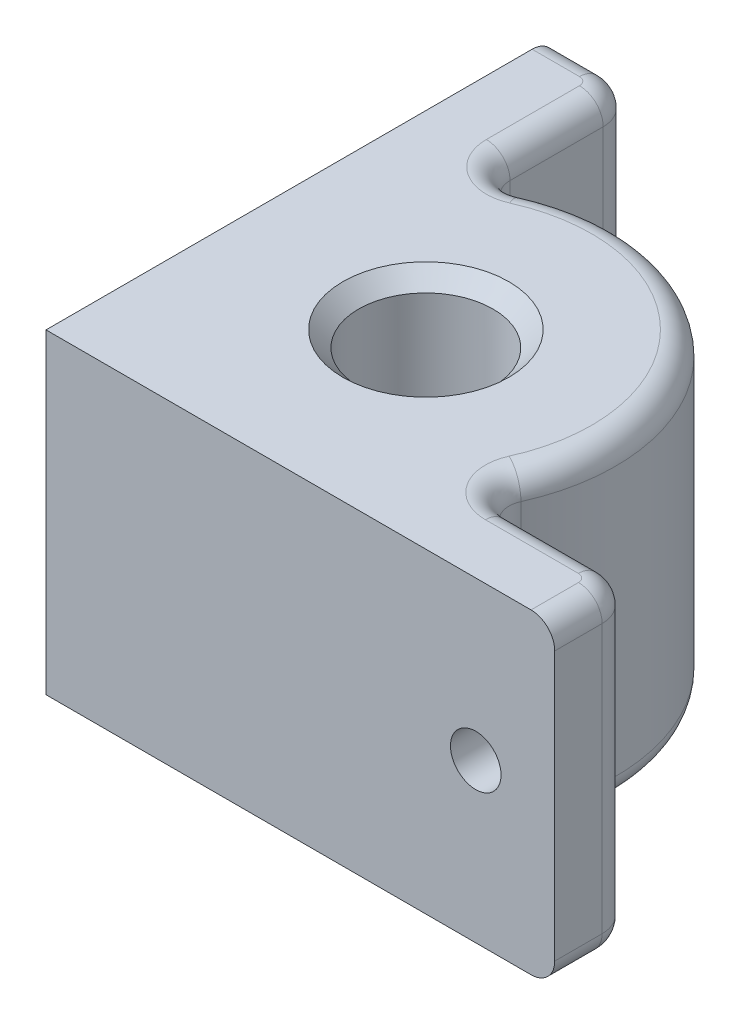
ISO-10303-21;
HEADER;
FILE_DESCRIPTION(('STEP AP214'),'2;1');
FILE_NAME('part.step','',(''),(''),'','','');
FILE_SCHEMA(('AUTOMOTIVE_DESIGN { 1 0 10303 214 1 1 1 1 }'));
ENDSEC;
DATA;
#1=APPLICATION_CONTEXT('core data for automotive mechanical design processes');
#2=APPLICATION_PROTOCOL_DEFINITION('international standard','automotive_design',2000,#1);
#3=PRODUCT_CONTEXT('',#1,'mechanical');
#4=PRODUCT('Part','Part','',(#3));
#5=PRODUCT_RELATED_PRODUCT_CATEGORY('part','',(#4));
#6=PRODUCT_DEFINITION_FORMATION('','',#4);
#7=PRODUCT_DEFINITION_CONTEXT('part definition',#1,'design');
#8=PRODUCT_DEFINITION('design','',#6,#7);
#9=PRODUCT_DEFINITION_SHAPE('','',#8);
#10=(LENGTH_UNIT() NAMED_UNIT(*) SI_UNIT(.MILLI.,.METRE.));
#11=(NAMED_UNIT(*) PLANE_ANGLE_UNIT() SI_UNIT($,.RADIAN.));
#12=(NAMED_UNIT(*) SI_UNIT($,.STERADIAN.) SOLID_ANGLE_UNIT());
#13=UNCERTAINTY_MEASURE_WITH_UNIT(LENGTH_MEASURE(1.E-05),#10,'distance_accuracy_value','');
#14=(GEOMETRIC_REPRESENTATION_CONTEXT(3) GLOBAL_UNCERTAINTY_ASSIGNED_CONTEXT((#13)) GLOBAL_UNIT_ASSIGNED_CONTEXT((#10,
#11,#12)) REPRESENTATION_CONTEXT('',''));
#15=CARTESIAN_POINT('',(0.,0.,0.));
#16=DIRECTION('',(0.,0.,1.));
#17=DIRECTION('',(1.,0.,0.));
#18=AXIS2_PLACEMENT_3D('',#15,#16,#17);
#19=CARTESIAN_POINT('',(65.4000000000055,170.67000014477,146.000000000005));
#20=DIRECTION('',(0.,1.,0.));
#21=DIRECTION('',(1.,0.,0.));
#22=AXIS2_PLACEMENT_3D('',#19,#20,#21);
#23=CYLINDRICAL_SURFACE('',#22,8.05000000000001);
#24=CARTESIAN_POINT('',(65.4000000000056,174.520000000011,146.000000000005));
#25=DIRECTION('',(0.,1.,0.));
#26=DIRECTION('',(1.,0.,0.));
#27=AXIS2_PLACEMENT_3D('',#24,#25,#26);
#28=CIRCLE('',#27,8.05000000000001);
#29=CARTESIAN_POINT('',(73.4500000000056,174.520000000011,146.000000000005));
#30=VERTEX_POINT('',#29);
#31=EDGE_CURVE('E11',#30,#30,#28,.T.);
#32=ORIENTED_EDGE('',*,*,#31,.T.);
#33=EDGE_LOOP('',(#32));
#34=FACE_BOUND('',#33,.T.);
#35=CARTESIAN_POINT('',(65.4000000000055,170.720000000011,146.000000000005));
#36=DIRECTION('',(0.,1.,0.));
#37=DIRECTION('',(-1.,0.,0.));
#38=AXIS2_PLACEMENT_3D('',#35,#36,#37);
#39=CIRCLE('',#38,8.05000000000001);
#40=CARTESIAN_POINT('',(57.3500000000055,170.720000000011,146.000000000005));
#41=VERTEX_POINT('',#40);
#42=EDGE_CURVE('E234',#41,#41,#39,.T.);
#43=ORIENTED_EDGE('',*,*,#42,.F.);
#44=EDGE_LOOP('',(#43));
#45=FACE_BOUND('',#44,.T.);
#46=ADVANCED_FACE('F38',(#34,#45),#23,.F.);
#47=CARTESIAN_POINT('',(60.9000153000318,180.020000000011,127.275000042648));
#48=DIRECTION('',(1.,0.,0.));
#49=DIRECTION('',(0.,0.,1.));
#50=AXIS2_PLACEMENT_3D('',#47,#48,#49);
#51=CYLINDRICAL_SURFACE('',#50,1.5);
#52=CARTESIAN_POINT('',(53.4000204000405,180.020000000011,127.275000042648));
#53=DIRECTION('',(1.,0.,0.));
#54=DIRECTION('',(0.,0.,1.));
#55=AXIS2_PLACEMENT_3D('',#52,#53,#54);
#56=CIRCLE('',#55,1.5);
#57=CARTESIAN_POINT('',(53.4000204000405,180.020000000011,125.775000042648));
#58=VERTEX_POINT('',#57);
#59=CARTESIAN_POINT('',(53.4000204000405,181.520000000011,127.275000042648));
#60=VERTEX_POINT('',#59);
#61=EDGE_CURVE('E48',#58,#60,#56,.T.);
#62=ORIENTED_EDGE('',*,*,#61,.T.);
#63=DIRECTION('',(1.,0.,0.));
#64=VECTOR('',#63,1.);
#65=CARTESIAN_POINT('',(60.9000153000319,181.520000000011,127.275000042648));
#66=LINE('',#65,#64);
#67=CARTESIAN_POINT('',(56.4000204000406,181.520000000011,127.275000042648));
#68=VERTEX_POINT('',#67);
#69=EDGE_CURVE('E57',#60,#68,#66,.T.);
#70=ORIENTED_EDGE('',*,*,#69,.T.);
#71=CARTESIAN_POINT('',(56.4000204000405,180.020000000011,127.275000042648));
#72=DIRECTION('',(-1.,0.,0.));
#73=DIRECTION('',(0.,0.,1.));
#74=AXIS2_PLACEMENT_3D('',#71,#72,#73);
#75=CIRCLE('',#74,1.49999999999999);
#76=CARTESIAN_POINT('',(56.4000204000405,180.020000000011,125.775000042648));
#77=VERTEX_POINT('',#76);
#78=EDGE_CURVE('E560',#68,#77,#75,.T.);
#79=ORIENTED_EDGE('',*,*,#78,.T.);
#80=DIRECTION('',(-1.,0.,0.));
#81=VECTOR('',#80,1.);
#82=CARTESIAN_POINT('',(60.9000153000318,180.020000000011,125.775000042648));
#83=LINE('',#82,#81);
#84=EDGE_CURVE('E557',#77,#58,#83,.T.);
#85=ORIENTED_EDGE('',*,*,#84,.T.);
#86=EDGE_LOOP('',(#62,#70,#79,#85));
#87=FACE_BOUND('',#86,.T.);
#88=ADVANCED_FACE('F258',(#87),#51,.T.);
#89=CARTESIAN_POINT('',(56.4000204000405,180.020000000011,127.775000042648));
#90=DIRECTION('',(0.,-1.,0.));
#91=DIRECTION('',(-1.,0.,0.));
#92=AXIS2_PLACEMENT_3D('',#89,#90,#91);
#93=DEGENERATE_TOROIDAL_SURFACE('',#92,0.5,1.5,.T.);
#94=CARTESIAN_POINT('',(56.9000204000405,180.020000000011,127.775000042648));
#95=DIRECTION('',(0.,0.,-1.));
#96=DIRECTION('',(0.,-1.,0.));
#97=AXIS2_PLACEMENT_3D('',#94,#95,#96);
#98=CIRCLE('',#97,1.49999999999999);
#99=CARTESIAN_POINT('',(56.9000204000406,181.520000000011,127.775000042648));
#100=VERTEX_POINT('',#99);
#101=CARTESIAN_POINT('',(58.4000204000405,180.020000000011,127.775000042648));
#102=VERTEX_POINT('',#101);
#103=EDGE_CURVE('E554',#100,#102,#98,.T.);
#104=ORIENTED_EDGE('',*,*,#103,.T.);
#105=CARTESIAN_POINT('',(56.4000204000405,180.020000000011,127.775000042648));
#106=DIRECTION('',(0.,1.,0.));
#107=DIRECTION('',(1.,0.,0.));
#108=AXIS2_PLACEMENT_3D('',#105,#106,#107);
#109=CIRCLE('',#108,2.);
#110=EDGE_CURVE('E552',#102,#77,#109,.T.);
#111=ORIENTED_EDGE('',*,*,#110,.T.);
#112=ORIENTED_EDGE('',*,*,#78,.F.);
#113=CARTESIAN_POINT('',(56.4000204000406,181.520000000011,127.775000042648));
#114=DIRECTION('',(0.,-1.,0.));
#115=DIRECTION('',(-1.,0.,0.));
#116=AXIS2_PLACEMENT_3D('',#113,#114,#115);
#117=CIRCLE('',#116,0.5);
#118=EDGE_CURVE('E550',#68,#100,#117,.T.);
#119=ORIENTED_EDGE('',*,*,#118,.T.);
#120=EDGE_LOOP('',(#104,#111,#112,#119));
#121=FACE_BOUND('',#120,.T.);
#122=ADVANCED_FACE('F264',(#121),#93,.T.);
#123=CARTESIAN_POINT('',(56.9000204000405,180.020000000011,136.697927492911));
#124=DIRECTION('',(0.,0.,1.));
#125=DIRECTION('',(1.,0.,0.));
#126=AXIS2_PLACEMENT_3D('',#123,#124,#125);
#127=CYLINDRICAL_SURFACE('',#126,1.5);
#128=CARTESIAN_POINT('',(56.9000204000405,180.020000000011,133.67116289345));
#129=DIRECTION('',(0.,0.,-1.));
#130=DIRECTION('',(0.,-1.,0.));
#131=AXIS2_PLACEMENT_3D('',#128,#129,#130);
#132=CIRCLE('',#131,1.49999999999999);
#133=CARTESIAN_POINT('',(56.9000204000405,181.520000000011,133.67116289345));
#134=VERTEX_POINT('',#133);
#135=CARTESIAN_POINT('',(58.4000204000405,180.020000000011,133.67116289345));
#136=VERTEX_POINT('',#135);
#137=EDGE_CURVE('E547',#134,#136,#132,.T.);
#138=ORIENTED_EDGE('',*,*,#137,.T.);
#139=DIRECTION('',(0.,0.,-1.));
#140=VECTOR('',#139,1.);
#141=CARTESIAN_POINT('',(58.4000204000405,180.020000000011,136.697927492911));
#142=LINE('',#141,#140);
#143=EDGE_CURVE('E543',#136,#102,#142,.T.);
#144=ORIENTED_EDGE('',*,*,#143,.T.);
#145=ORIENTED_EDGE('',*,*,#103,.F.);
#146=DIRECTION('',(0.,0.,1.));
#147=VECTOR('',#146,1.);
#148=CARTESIAN_POINT('',(56.9000204000405,181.520000000011,136.697927492911));
#149=LINE('',#148,#147);
#150=EDGE_CURVE('E541',#100,#134,#149,.T.);
#151=ORIENTED_EDGE('',*,*,#150,.T.);
#152=EDGE_LOOP('',(#138,#144,#145,#151));
#153=FACE_BOUND('',#152,.T.);
#154=ADVANCED_FACE('F329',(#153),#127,.T.);
#155=CARTESIAN_POINT('',(59.9000204000405,180.020000000011,133.67116289345));
#156=DIRECTION('',(0.,1.,0.));
#157=DIRECTION('',(1.,0.,0.));
#158=AXIS2_PLACEMENT_3D('',#155,#156,#157);
#159=TOROIDAL_SURFACE('',#158,3.,1.5);
#160=CARTESIAN_POINT('',(61.1222380889217,180.020000000011,136.410904472685));
#161=DIRECTION('',(-0.913247193078141,0.,0.407405896293728));
#162=DIRECTION('',(0.,1.,0.));
#163=AXIS2_PLACEMENT_3D('',#160,#161,#162);
#164=CIRCLE('',#163,1.49999999999999);
#165=CARTESIAN_POINT('',(61.1222380889218,181.520000000011,136.410904472685));
#166=VERTEX_POINT('',#165);
#167=CARTESIAN_POINT('',(60.5111292444811,180.020000000011,135.041033683068));
#168=VERTEX_POINT('',#167);
#169=EDGE_CURVE('E539',#166,#168,#164,.T.);
#170=ORIENTED_EDGE('',*,*,#169,.T.);
#171=CARTESIAN_POINT('',(59.9000204000405,180.020000000011,133.67116289345));
#172=DIRECTION('',(0.,-1.,0.));
#173=DIRECTION('',(-1.,0.,0.));
#174=AXIS2_PLACEMENT_3D('',#171,#172,#173);
#175=CIRCLE('',#174,1.5);
#176=EDGE_CURVE('E490',#168,#136,#175,.T.);
#177=ORIENTED_EDGE('',*,*,#176,.T.);
#178=ORIENTED_EDGE('',*,*,#137,.F.);
#179=CARTESIAN_POINT('',(59.9000204000406,181.520000000011,133.67116289345));
#180=DIRECTION('',(0.,1.,0.));
#181=DIRECTION('',(1.,0.,0.));
#182=AXIS2_PLACEMENT_3D('',#179,#180,#181);
#183=CIRCLE('',#182,3.);
#184=EDGE_CURVE('E488',#134,#166,#183,.T.);
#185=ORIENTED_EDGE('',*,*,#184,.T.);
#186=EDGE_LOOP('',(#170,#177,#178,#185));
#187=FACE_BOUND('',#186,.T.);
#188=ADVANCED_FACE('F332',(#187),#159,.T.);
#189=CARTESIAN_POINT('',(65.4000000000058,180.020000000011,146.000000000005));
#190=DIRECTION('',(0.,-1.,0.));
#191=DIRECTION('',(-1.,0.,0.));
#192=AXIS2_PLACEMENT_3D('',#189,#190,#191);
#193=TOROIDAL_SURFACE('',#192,10.5,1.5);
#194=CARTESIAN_POINT('',(74.9751488895736,180.02000000001,150.30888892206));
#195=DIRECTION('',(0.410370373529056,0.,-0.911918941863597));
#196=DIRECTION('',(0.,-1.,0.));
#197=AXIS2_PLACEMENT_3D('',#194,#195,#196);
#198=CIRCLE('',#197,1.49999999999999);
#199=CARTESIAN_POINT('',(74.9751488895736,181.52000000001,150.30888892206));
#200=VERTEX_POINT('',#199);
#201=CARTESIAN_POINT('',(76.343027302369,180.02000000001,150.924444482354));
#202=VERTEX_POINT('',#201);
#203=EDGE_CURVE('E484',#200,#202,#198,.T.);
#204=ORIENTED_EDGE('',*,*,#203,.T.);
#205=CARTESIAN_POINT('',(65.4000000000058,180.020000000011,146.000000000005));
#206=DIRECTION('',(0.,1.,0.));
#207=DIRECTION('',(1.,0.,0.));
#208=AXIS2_PLACEMENT_3D('',#205,#206,#207);
#209=CIRCLE('',#208,12.);
#210=EDGE_CURVE('E478',#202,#168,#209,.T.);
#211=ORIENTED_EDGE('',*,*,#210,.T.);
#212=ORIENTED_EDGE('',*,*,#169,.F.);
#213=CARTESIAN_POINT('',(65.4000000000059,181.520000000011,146.000000000005));
#214=DIRECTION('',(0.,-1.,0.));
#215=DIRECTION('',(-1.,0.,0.));
#216=AXIS2_PLACEMENT_3D('',#213,#214,#215);
#217=CIRCLE('',#216,10.5);
#218=EDGE_CURVE('E388',#166,#200,#217,.T.);
#219=ORIENTED_EDGE('',*,*,#218,.T.);
#220=EDGE_LOOP('',(#204,#211,#212,#219));
#221=FACE_BOUND('',#220,.T.);
#222=ADVANCED_FACE('F486',(#221),#193,.T.);
#223=CARTESIAN_POINT('',(77.7109057151644,180.02000000001,151.540000042648));
#224=DIRECTION('',(0.,1.,0.));
#225=DIRECTION('',(1.,0.,0.));
#226=AXIS2_PLACEMENT_3D('',#223,#224,#225);
#227=TOROIDAL_SURFACE('',#226,3.,1.5);
#228=CARTESIAN_POINT('',(77.7109057151644,180.02000000001,154.540000042648));
#229=DIRECTION('',(-1.,0.,0.));
#230=DIRECTION('',(0.,0.,1.));
#231=AXIS2_PLACEMENT_3D('',#228,#229,#230);
#232=CIRCLE('',#231,1.49999999999999);
#233=CARTESIAN_POINT('',(77.7109057151644,181.52000000001,154.540000042648));
#234=VERTEX_POINT('',#233);
#235=CARTESIAN_POINT('',(77.7109057151644,180.02000000001,153.040000042648));
#236=VERTEX_POINT('',#235);
#237=EDGE_CURVE('E382',#234,#236,#232,.T.);
#238=ORIENTED_EDGE('',*,*,#237,.T.);
#239=CARTESIAN_POINT('',(77.7109057151644,180.02000000001,151.540000042648));
#240=DIRECTION('',(0.,-1.,0.));
#241=DIRECTION('',(-1.,0.,0.));
#242=AXIS2_PLACEMENT_3D('',#239,#240,#241);
#243=CIRCLE('',#242,1.5);
#244=EDGE_CURVE('E372',#236,#202,#243,.T.);
#245=ORIENTED_EDGE('',*,*,#244,.T.);
#246=ORIENTED_EDGE('',*,*,#203,.F.);
#247=CARTESIAN_POINT('',(77.7109057151644,181.52000000001,151.540000042648));
#248=DIRECTION('',(0.,1.,0.));
#249=DIRECTION('',(1.,0.,0.));
#250=AXIS2_PLACEMENT_3D('',#247,#248,#249);
#251=CIRCLE('',#250,3.);
#252=EDGE_CURVE('E383',#200,#234,#251,.T.);
#253=ORIENTED_EDGE('',*,*,#252,.T.);
#254=EDGE_LOOP('',(#238,#245,#246,#253));
#255=FACE_BOUND('',#254,.T.);
#256=ADVANCED_FACE('F338',(#255),#227,.T.);
#257=CARTESIAN_POINT('',(71.3541716694838,180.020000000011,154.540000042648));
#258=DIRECTION('',(1.,0.,0.));
#259=DIRECTION('',(0.,0.,1.));
#260=AXIS2_PLACEMENT_3D('',#257,#258,#259);
#261=CYLINDRICAL_SURFACE('',#260,1.5);
#262=CARTESIAN_POINT('',(83.5980204000405,180.02000000001,154.540000042648));
#263=DIRECTION('',(-1.,0.,0.));
#264=DIRECTION('',(0.,0.,1.));
#265=AXIS2_PLACEMENT_3D('',#262,#263,#264);
#266=CIRCLE('',#265,1.49999999999999);
#267=CARTESIAN_POINT('',(83.5980204000406,181.52000000001,154.540000042648));
#268=VERTEX_POINT('',#267);
#269=CARTESIAN_POINT('',(83.5980204000405,180.02000000001,153.040000042648));
#270=VERTEX_POINT('',#269);
#271=EDGE_CURVE('E496',#268,#270,#266,.T.);
#272=ORIENTED_EDGE('',*,*,#271,.T.);
#273=DIRECTION('',(-1.,0.,0.));
#274=VECTOR('',#273,1.);
#275=CARTESIAN_POINT('',(71.3541716694838,180.020000000011,153.040000042648));
#276=LINE('',#275,#274);
#277=EDGE_CURVE('E393',#270,#236,#276,.T.);
#278=ORIENTED_EDGE('',*,*,#277,.T.);
#279=ORIENTED_EDGE('',*,*,#237,.F.);
#280=DIRECTION('',(1.,0.,0.));
#281=VECTOR('',#280,1.);
#282=CARTESIAN_POINT('',(71.3541716694838,181.520000000011,154.540000042648));
#283=LINE('',#282,#281);
#284=EDGE_CURVE('E499',#234,#268,#283,.T.);
#285=ORIENTED_EDGE('',*,*,#284,.T.);
#286=EDGE_LOOP('',(#272,#278,#279,#285));
#287=FACE_BOUND('',#286,.T.);
#288=ADVANCED_FACE('F334',(#287),#261,.T.);
#289=CARTESIAN_POINT('',(83.5980204000405,180.02000000001,155.040000042648));
#290=DIRECTION('',(0.,-1.,0.));
#291=DIRECTION('',(-1.,0.,0.));
#292=AXIS2_PLACEMENT_3D('',#289,#290,#291);
#293=DEGENERATE_TOROIDAL_SURFACE('',#292,0.5,1.5,.T.);
#294=CARTESIAN_POINT('',(84.0980204000405,180.02000000001,155.040000042648));
#295=DIRECTION('',(0.,0.,-1.));
#296=DIRECTION('',(0.,-1.,0.));
#297=AXIS2_PLACEMENT_3D('',#294,#295,#296);
#298=CIRCLE('',#297,1.49999999999995);
#299=CARTESIAN_POINT('',(84.0980204000406,181.52000000001,155.040000042648));
#300=VERTEX_POINT('',#299);
#301=CARTESIAN_POINT('',(85.5980204000405,180.02000000001,155.040000042648));
#302=VERTEX_POINT('',#301);
#303=EDGE_CURVE('E501',#300,#302,#298,.T.);
#304=ORIENTED_EDGE('',*,*,#303,.T.);
#305=CARTESIAN_POINT('',(83.5980204000405,180.02000000001,155.040000042648));
#306=DIRECTION('',(0.,1.,0.));
#307=DIRECTION('',(1.,0.,0.));
#308=AXIS2_PLACEMENT_3D('',#305,#306,#307);
#309=CIRCLE('',#308,2.);
#310=EDGE_CURVE('E504',#302,#270,#309,.T.);
#311=ORIENTED_EDGE('',*,*,#310,.T.);
#312=ORIENTED_EDGE('',*,*,#271,.F.);
#313=CARTESIAN_POINT('',(83.5980204000406,181.52000000001,155.040000042648));
#314=DIRECTION('',(0.,-1.,0.));
#315=DIRECTION('',(-1.,0.,0.));
#316=AXIS2_PLACEMENT_3D('',#313,#314,#315);
#317=CIRCLE('',#316,0.5);
#318=EDGE_CURVE('E506',#268,#300,#317,.T.);
#319=ORIENTED_EDGE('',*,*,#318,.T.);
#320=EDGE_LOOP('',(#304,#311,#312,#319));
#321=FACE_BOUND('',#320,.T.);
#322=ADVANCED_FACE('F337',(#321),#293,.T.);
#323=CARTESIAN_POINT('',(84.0980204000405,180.02000000001,148.540000042648));
#324=DIRECTION('',(0.,0.,1.));
#325=DIRECTION('',(1.,0.,0.));
#326=AXIS2_PLACEMENT_3D('',#323,#324,#325);
#327=CYLINDRICAL_SURFACE('',#326,1.5);
#328=DIRECTION('',(0.,0.,-1.));
#329=VECTOR('',#328,1.);
#330=CARTESIAN_POINT('',(85.5980204000405,180.02000000001,148.540000042648));
#331=LINE('',#330,#329);
#332=CARTESIAN_POINT('',(85.5980204000405,180.02000000001,158.040000042648));
#333=VERTEX_POINT('',#332);
#334=EDGE_CURVE('E511',#333,#302,#331,.T.);
#335=ORIENTED_EDGE('',*,*,#334,.T.);
#336=ORIENTED_EDGE('',*,*,#303,.F.);
#337=DIRECTION('',(0.,0.,1.));
#338=VECTOR('',#337,1.);
#339=CARTESIAN_POINT('',(84.0980204000405,181.52000000001,148.540000042648));
#340=LINE('',#339,#338);
#341=CARTESIAN_POINT('',(84.0980204000405,181.52000000001,158.040000042648));
#342=VERTEX_POINT('',#341);
#343=EDGE_CURVE('E513',#300,#342,#340,.T.);
#344=ORIENTED_EDGE('',*,*,#343,.T.);
#345=CARTESIAN_POINT('',(84.0980204000405,180.02000000001,158.040000042648));
#346=DIRECTION('',(0.,0.,-1.));
#347=DIRECTION('',(-1.,0.,0.));
#348=AXIS2_PLACEMENT_3D('',#345,#346,#347);
#349=CIRCLE('',#348,1.5);
#350=EDGE_CURVE('E508',#342,#333,#349,.T.);
#351=ORIENTED_EDGE('',*,*,#350,.T.);
#352=EDGE_LOOP('',(#335,#336,#344,#351));
#353=FACE_BOUND('',#352,.T.);
#354=ADVANCED_FACE('F340',(#353),#327,.T.);
#355=CARTESIAN_POINT('',(53.4000204000403,173.520000000011,125.775000042648));
#356=DIRECTION('',(0.,0.,-1.));
#357=DIRECTION('',(0.,1.,0.));
#358=AXIS2_PLACEMENT_3D('',#355,#356,#357);
#359=PLANE('',#358);
#360=ORIENTED_EDGE('',*,*,#84,.F.);
#361=DIRECTION('',(0.,1.,0.));
#362=VECTOR('',#361,1.);
#363=CARTESIAN_POINT('',(56.4000204000402,172.520000000011,125.775000042648));
#364=LINE('',#363,#362);
#365=CARTESIAN_POINT('',(56.4000204000399,163.020000000011,125.775000042647));
#366=VERTEX_POINT('',#365);
#367=EDGE_CURVE('E516',#366,#77,#364,.T.);
#368=ORIENTED_EDGE('',*,*,#367,.F.);
#369=DIRECTION('',(1.,0.,0.));
#370=VECTOR('',#369,1.);
#371=CARTESIAN_POINT('',(60.9000153000312,163.020000000011,125.775000042647));
#372=LINE('',#371,#370);
#373=CARTESIAN_POINT('',(53.4000204000399,163.020000000011,125.775000042647));
#374=VERTEX_POINT('',#373);
#375=EDGE_CURVE('E432',#374,#366,#372,.T.);
#376=ORIENTED_EDGE('',*,*,#375,.F.);
#377=DIRECTION('',(0.,-1.,0.));
#378=VECTOR('',#377,1.);
#379=CARTESIAN_POINT('',(53.4000204000403,173.520000000011,125.775000042647));
#380=LINE('',#379,#378);
#381=EDGE_CURVE('E231',#58,#374,#380,.T.);
#382=ORIENTED_EDGE('',*,*,#381,.F.);
#383=EDGE_LOOP('',(#360,#368,#376,#382));
#384=FACE_BOUND('',#383,.T.);
#385=ADVANCED_FACE('F343',(#384),#359,.T.);
#386=CARTESIAN_POINT('',(56.4000204000402,172.520000000011,127.775000042647));
#387=DIRECTION('',(0.,1.,0.));
#388=DIRECTION('',(1.,0.,0.));
#389=AXIS2_PLACEMENT_3D('',#386,#387,#388);
#390=CYLINDRICAL_SURFACE('',#389,2.);
#391=ORIENTED_EDGE('',*,*,#110,.F.);
#392=DIRECTION('',(0.,-1.,0.));
#393=VECTOR('',#392,1.);
#394=CARTESIAN_POINT('',(58.4000204000402,172.520000000011,127.775000042647));
#395=LINE('',#394,#393);
#396=CARTESIAN_POINT('',(58.4000204000399,163.020000000011,127.775000042647));
#397=VERTEX_POINT('',#396);
#398=EDGE_CURVE('E515',#102,#397,#395,.T.);
#399=ORIENTED_EDGE('',*,*,#398,.T.);
#400=CARTESIAN_POINT('',(56.4000204000399,163.020000000011,127.775000042647));
#401=DIRECTION('',(0.,-1.,0.));
#402=DIRECTION('',(-1.,0.,0.));
#403=AXIS2_PLACEMENT_3D('',#400,#401,#402);
#404=CIRCLE('',#403,2.);
#405=EDGE_CURVE('E445',#366,#397,#404,.T.);
#406=ORIENTED_EDGE('',*,*,#405,.F.);
#407=ORIENTED_EDGE('',*,*,#367,.T.);
#408=EDGE_LOOP('',(#391,#399,#406,#407));
#409=FACE_BOUND('',#408,.T.);
#410=ADVANCED_FACE('F345',(#409),#390,.T.);
#411=CARTESIAN_POINT('',(58.4000204000402,171.520000000011,130.355854943175));
#412=DIRECTION('',(1.,0.,0.));
#413=DIRECTION('',(0.,1.,0.));
#414=AXIS2_PLACEMENT_3D('',#411,#412,#413);
#415=PLANE('',#414);
#416=ORIENTED_EDGE('',*,*,#143,.F.);
#417=DIRECTION('',(0.,1.,0.));
#418=VECTOR('',#417,1.);
#419=CARTESIAN_POINT('',(58.4000204000403,173.520000000011,133.67116289345));
#420=LINE('',#419,#418);
#421=CARTESIAN_POINT('',(58.4000204000399,163.020000000011,133.67116289345));
#422=VERTEX_POINT('',#421);
#423=EDGE_CURVE('E396',#422,#136,#420,.T.);
#424=ORIENTED_EDGE('',*,*,#423,.F.);
#425=DIRECTION('',(0.,0.,1.));
#426=VECTOR('',#425,1.);
#427=CARTESIAN_POINT('',(58.4000204000399,163.020000000011,136.697927492911));
#428=LINE('',#427,#426);
#429=EDGE_CURVE('E452',#397,#422,#428,.T.);
#430=ORIENTED_EDGE('',*,*,#429,.F.);
#431=ORIENTED_EDGE('',*,*,#398,.F.);
#432=EDGE_LOOP('',(#416,#424,#430,#431));
#433=FACE_BOUND('',#432,.T.);
#434=CARTESIAN_POINT('',(58.4000204000402,171.520000000011,130.775014209364));
#435=DIRECTION('',(-1.,0.,0.));
#436=DIRECTION('',(0.,0.,1.));
#437=AXIS2_PLACEMENT_3D('',#434,#435,#436);
#438=CIRCLE('',#437,1.6);
#439=CARTESIAN_POINT('',(58.4000204000402,171.520000000011,132.375014209364));
#440=VERTEX_POINT('',#439);
#441=EDGE_CURVE('E519',#440,#440,#438,.T.);
#442=ORIENTED_EDGE('',*,*,#441,.T.);
#443=EDGE_LOOP('',(#442));
#444=FACE_BOUND('',#443,.T.);
#445=ADVANCED_FACE('F348',(#433,#444),#415,.T.);
#446=CARTESIAN_POINT('',(59.9000204000403,173.520000000011,133.67116289345));
#447=DIRECTION('',(0.,-1.,0.));
#448=DIRECTION('',(-1.,0.,0.));
#449=AXIS2_PLACEMENT_3D('',#446,#447,#448);
#450=CYLINDRICAL_SURFACE('',#449,1.5);
#451=ORIENTED_EDGE('',*,*,#176,.F.);
#452=DIRECTION('',(0.,-1.,0.));
#453=VECTOR('',#452,1.);
#454=CARTESIAN_POINT('',(60.5111292444809,173.520000000011,135.041033683067));
#455=LINE('',#454,#453);
#456=CARTESIAN_POINT('',(60.5111292444805,163.020000000011,135.041033683067));
#457=VERTEX_POINT('',#456);
#458=EDGE_CURVE('E399',#168,#457,#455,.T.);
#459=ORIENTED_EDGE('',*,*,#458,.T.);
#460=CARTESIAN_POINT('',(59.9000204000399,163.020000000011,133.67116289345));
#461=DIRECTION('',(0.,1.,0.));
#462=DIRECTION('',(1.,0.,0.));
#463=AXIS2_PLACEMENT_3D('',#460,#461,#462);
#464=CIRCLE('',#463,1.5);
#465=EDGE_CURVE('E459',#422,#457,#464,.T.);
#466=ORIENTED_EDGE('',*,*,#465,.F.);
#467=ORIENTED_EDGE('',*,*,#423,.T.);
#468=EDGE_LOOP('',(#451,#459,#466,#467));
#469=FACE_BOUND('',#468,.T.);
#470=ADVANCED_FACE('F352',(#469),#450,.F.);
#471=CARTESIAN_POINT('',(65.4000000000056,173.520000000011,146.000000000005));
#472=DIRECTION('',(0.,-1.,0.));
#473=DIRECTION('',(-1.,0.,0.));
#474=AXIS2_PLACEMENT_3D('',#471,#472,#473);
#475=CYLINDRICAL_SURFACE('',#474,12.);
#476=ORIENTED_EDGE('',*,*,#210,.F.);
#477=DIRECTION('',(0.,1.,0.));
#478=VECTOR('',#477,1.);
#479=CARTESIAN_POINT('',(76.3430273023687,173.52000000001,150.924444482354));
#480=LINE('',#479,#478);
#481=CARTESIAN_POINT('',(76.3430273023684,163.02000000001,150.924444482354));
#482=VERTEX_POINT('',#481);
#483=EDGE_CURVE('E378',#482,#202,#480,.T.);
#484=ORIENTED_EDGE('',*,*,#483,.F.);
#485=CARTESIAN_POINT('',(65.4000000000052,163.020000000011,146.000000000005));
#486=DIRECTION('',(0.,-1.,0.));
#487=DIRECTION('',(-1.,0.,0.));
#488=AXIS2_PLACEMENT_3D('',#485,#486,#487);
#489=CIRCLE('',#488,12.);
#490=EDGE_CURVE('E405',#457,#482,#489,.T.);
#491=ORIENTED_EDGE('',*,*,#490,.F.);
#492=ORIENTED_EDGE('',*,*,#458,.F.);
#493=EDGE_LOOP('',(#476,#484,#491,#492));
#494=FACE_BOUND('',#493,.T.);
#495=ADVANCED_FACE('F356',(#494),#475,.T.);
#496=CARTESIAN_POINT('',(77.7109057151641,173.52000000001,151.540000042648));
#497=DIRECTION('',(0.,-1.,0.));
#498=DIRECTION('',(-1.,0.,0.));
#499=AXIS2_PLACEMENT_3D('',#496,#497,#498);
#500=CYLINDRICAL_SURFACE('',#499,1.5);
#501=ORIENTED_EDGE('',*,*,#244,.F.);
#502=DIRECTION('',(0.,-1.,0.));
#503=VECTOR('',#502,1.);
#504=CARTESIAN_POINT('',(77.7109057151641,173.52000000001,153.040000042648));
#505=LINE('',#504,#503);
#506=CARTESIAN_POINT('',(77.7109057151638,163.02000000001,153.040000042647));
#507=VERTEX_POINT('',#506);
#508=EDGE_CURVE('E375',#236,#507,#505,.T.);
#509=ORIENTED_EDGE('',*,*,#508,.T.);
#510=CARTESIAN_POINT('',(77.7109057151638,163.02000000001,151.540000042647));
#511=DIRECTION('',(0.,1.,0.));
#512=DIRECTION('',(1.,0.,0.));
#513=AXIS2_PLACEMENT_3D('',#510,#511,#512);
#514=CIRCLE('',#513,1.5);
#515=EDGE_CURVE('E406',#482,#507,#514,.T.);
#516=ORIENTED_EDGE('',*,*,#515,.F.);
#517=ORIENTED_EDGE('',*,*,#483,.T.);
#518=EDGE_LOOP('',(#501,#509,#516,#517));
#519=FACE_BOUND('',#518,.T.);
#520=ADVANCED_FACE('F359',(#519),#500,.F.);
#521=CARTESIAN_POINT('',(74.3083331389442,173.520000000011,153.040000042648));
#522=DIRECTION('',(0.,0.,-1.));
#523=DIRECTION('',(0.,1.,0.));
#524=AXIS2_PLACEMENT_3D('',#521,#522,#523);
#525=PLANE('',#524);
#526=CARTESIAN_POINT('',(80.5981426744383,171.52000000001,153.040000042648));
#527=DIRECTION('',(0.,0.,-1.));
#528=DIRECTION('',(-1.,0.,0.));
#529=AXIS2_PLACEMENT_3D('',#526,#527,#528);
#530=CIRCLE('',#529,1.6);
#531=CARTESIAN_POINT('',(78.9981426744383,171.52000000001,153.040000042648));
#532=VERTEX_POINT('',#531);
#533=EDGE_CURVE('E227',#532,#532,#530,.T.);
#534=ORIENTED_EDGE('',*,*,#533,.F.);
#535=EDGE_LOOP('',(#534));
#536=FACE_BOUND('',#535,.T.);
#537=ORIENTED_EDGE('',*,*,#277,.F.);
#538=DIRECTION('',(0.,1.,0.));
#539=VECTOR('',#538,1.);
#540=CARTESIAN_POINT('',(83.5980204000403,173.52000000001,153.040000042648));
#541=LINE('',#540,#539);
#542=CARTESIAN_POINT('',(83.5980204000399,163.02000000001,153.040000042647));
#543=VERTEX_POINT('',#542);
#544=EDGE_CURVE('E412',#543,#270,#541,.T.);
#545=ORIENTED_EDGE('',*,*,#544,.F.);
#546=DIRECTION('',(1.,0.,0.));
#547=VECTOR('',#546,1.);
#548=CARTESIAN_POINT('',(71.3541716694832,163.020000000011,153.040000042647));
#549=LINE('',#548,#547);
#550=EDGE_CURVE('E204',#507,#543,#549,.T.);
#551=ORIENTED_EDGE('',*,*,#550,.F.);
#552=ORIENTED_EDGE('',*,*,#508,.F.);
#553=EDGE_LOOP('',(#537,#545,#551,#552));
#554=FACE_BOUND('',#553,.T.);
#555=ADVANCED_FACE('F362',(#536,#554),#525,.T.);
#556=CARTESIAN_POINT('',(83.5980204000403,173.52000000001,155.040000042648));
#557=DIRECTION('',(0.,-1.,0.));
#558=DIRECTION('',(-1.,0.,0.));
#559=AXIS2_PLACEMENT_3D('',#556,#557,#558);
#560=CYLINDRICAL_SURFACE('',#559,2.);
#561=ORIENTED_EDGE('',*,*,#310,.F.);
#562=DIRECTION('',(0.,-1.,0.));
#563=VECTOR('',#562,1.);
#564=CARTESIAN_POINT('',(85.5980204000403,173.52000000001,155.040000042648));
#565=LINE('',#564,#563);
#566=CARTESIAN_POINT('',(85.5980204000399,163.02000000001,155.040000042647));
#567=VERTEX_POINT('',#566);
#568=EDGE_CURVE('E401',#302,#567,#565,.T.);
#569=ORIENTED_EDGE('',*,*,#568,.T.);
#570=CARTESIAN_POINT('',(83.5980204000399,163.02000000001,155.040000042647));
#571=DIRECTION('',(0.,-1.,0.));
#572=DIRECTION('',(-1.,0.,0.));
#573=AXIS2_PLACEMENT_3D('',#570,#571,#572);
#574=CIRCLE('',#573,2.);
#575=EDGE_CURVE('E199',#543,#567,#574,.T.);
#576=ORIENTED_EDGE('',*,*,#575,.F.);
#577=ORIENTED_EDGE('',*,*,#544,.T.);
#578=EDGE_LOOP('',(#561,#569,#576,#577));
#579=FACE_BOUND('',#578,.T.);
#580=ADVANCED_FACE('F270',(#579),#560,.T.);
#581=CARTESIAN_POINT('',(85.5980204000403,173.52000000001,154.040000042648));
#582=DIRECTION('',(1.,0.,0.));
#583=DIRECTION('',(0.,1.,0.));
#584=AXIS2_PLACEMENT_3D('',#581,#582,#583);
#585=PLANE('',#584);
#586=DIRECTION('',(0.,-1.,0.));
#587=VECTOR('',#586,1.);
#588=CARTESIAN_POINT('',(85.5980204000403,173.52000000001,158.040000042648));
#589=LINE('',#588,#587);
#590=CARTESIAN_POINT('',(85.5980204000399,163.02000000001,158.040000042647));
#591=VERTEX_POINT('',#590);
#592=EDGE_CURVE('E414',#333,#591,#589,.T.);
#593=ORIENTED_EDGE('',*,*,#592,.T.);
#594=DIRECTION('',(0.,0.,1.));
#595=VECTOR('',#594,1.);
#596=CARTESIAN_POINT('',(85.5980204000399,163.02000000001,148.540000042647));
#597=LINE('',#596,#595);
#598=EDGE_CURVE('E191',#567,#591,#597,.T.);
#599=ORIENTED_EDGE('',*,*,#598,.F.);
#600=ORIENTED_EDGE('',*,*,#568,.F.);
#601=ORIENTED_EDGE('',*,*,#334,.F.);
#602=EDGE_LOOP('',(#593,#599,#600,#601));
#603=FACE_BOUND('',#602,.T.);
#604=ADVANCED_FACE('F585',(#603),#585,.T.);
#605=CARTESIAN_POINT('',(83.4000204000403,173.52000000001,158.040000042648));
#606=DIRECTION('',(0.,0.,1.));
#607=DIRECTION('',(0.,-1.,0.));
#608=AXIS2_PLACEMENT_3D('',#605,#606,#607);
#609=PLANE('',#608);
#610=ORIENTED_EDGE('',*,*,#350,.F.);
#611=DIRECTION('',(1.,0.,0.));
#612=VECTOR('',#611,1.);
#613=CARTESIAN_POINT('',(75.9000153000319,181.52000000001,158.040000042648));
#614=LINE('',#613,#612);
#615=CARTESIAN_POINT('',(53.4000204000405,181.520000000011,158.040000042648));
#616=VERTEX_POINT('',#615);
#617=EDGE_CURVE('E219',#616,#342,#614,.T.);
#618=ORIENTED_EDGE('',*,*,#617,.F.);
#619=DIRECTION('',(0.,-1.,0.));
#620=VECTOR('',#619,1.);
#621=CARTESIAN_POINT('',(53.4000204000403,173.520000000011,158.040000042648));
#622=LINE('',#621,#620);
#623=CARTESIAN_POINT('',(53.4000204000399,161.520000000011,158.040000042647));
#624=VERTEX_POINT('',#623);
#625=EDGE_CURVE('E420',#616,#624,#622,.T.);
#626=ORIENTED_EDGE('',*,*,#625,.T.);
#627=DIRECTION('',(-1.,0.,0.));
#628=VECTOR('',#627,1.);
#629=CARTESIAN_POINT('',(75.9000153000312,161.52000000001,158.040000042647));
#630=LINE('',#629,#628);
#631=CARTESIAN_POINT('',(84.0980204000399,161.52000000001,158.040000042647));
#632=VERTEX_POINT('',#631);
#633=EDGE_CURVE('E213',#632,#624,#630,.T.);
#634=ORIENTED_EDGE('',*,*,#633,.F.);
#635=CARTESIAN_POINT('',(84.0980204000399,163.02000000001,158.040000042647));
#636=DIRECTION('',(0.,0.,-1.));
#637=DIRECTION('',(-1.,0.,0.));
#638=AXIS2_PLACEMENT_3D('',#635,#636,#637);
#639=CIRCLE('',#638,1.5);
#640=EDGE_CURVE('E190',#591,#632,#639,.T.);
#641=ORIENTED_EDGE('',*,*,#640,.F.);
#642=ORIENTED_EDGE('',*,*,#592,.F.);
#643=EDGE_LOOP('',(#610,#618,#626,#634,#641,#642));
#644=FACE_BOUND('',#643,.T.);
#645=CARTESIAN_POINT('',(80.5981426744383,171.52000000001,158.040000042648));
#646=DIRECTION('',(0.,0.,1.));
#647=DIRECTION('',(1.,0.,0.));
#648=AXIS2_PLACEMENT_3D('',#645,#646,#647);
#649=CIRCLE('',#648,1.6);
#650=CARTESIAN_POINT('',(82.1981426744384,171.52000000001,158.040000042648));
#651=VERTEX_POINT('',#650);
#652=EDGE_CURVE('E223',#651,#651,#649,.T.);
#653=ORIENTED_EDGE('',*,*,#652,.F.);
#654=EDGE_LOOP('',(#653));
#655=FACE_BOUND('',#654,.T.);
#656=ADVANCED_FACE('F276',(#644,#655),#609,.T.);
#657=CARTESIAN_POINT('',(60.9000153000312,163.020000000011,127.275000042647));
#658=DIRECTION('',(1.,0.,0.));
#659=DIRECTION('',(0.,0.,1.));
#660=AXIS2_PLACEMENT_3D('',#657,#658,#659);
#661=CYLINDRICAL_SURFACE('',#660,1.5);
#662=CARTESIAN_POINT('',(53.4000204000399,163.020000000011,127.275000042647));
#663=DIRECTION('',(1.,0.,0.));
#664=DIRECTION('',(0.,0.,1.));
#665=AXIS2_PLACEMENT_3D('',#662,#663,#664);
#666=CIRCLE('',#665,1.5);
#667=CARTESIAN_POINT('',(53.4000204000399,161.520000000011,127.275000042647));
#668=VERTEX_POINT('',#667);
#669=EDGE_CURVE('E425',#668,#374,#666,.T.);
#670=ORIENTED_EDGE('',*,*,#669,.T.);
#671=ORIENTED_EDGE('',*,*,#375,.T.);
#672=CARTESIAN_POINT('',(56.4000204000399,163.020000000011,127.275000042647));
#673=DIRECTION('',(-1.,0.,0.));
#674=DIRECTION('',(0.,0.,1.));
#675=AXIS2_PLACEMENT_3D('',#672,#673,#674);
#676=CIRCLE('',#675,1.5);
#677=CARTESIAN_POINT('',(56.4000204000399,161.520000000011,127.275000042647));
#678=VERTEX_POINT('',#677);
#679=EDGE_CURVE('E433',#366,#678,#676,.T.);
#680=ORIENTED_EDGE('',*,*,#679,.T.);
#681=DIRECTION('',(-1.,0.,0.));
#682=VECTOR('',#681,1.);
#683=CARTESIAN_POINT('',(60.9000153000312,161.520000000011,127.275000042647));
#684=LINE('',#683,#682);
#685=EDGE_CURVE('E436',#678,#668,#684,.T.);
#686=ORIENTED_EDGE('',*,*,#685,.T.);
#687=EDGE_LOOP('',(#670,#671,#680,#686));
#688=FACE_BOUND('',#687,.T.);
#689=ADVANCED_FACE('F272',(#688),#661,.T.);
#690=CARTESIAN_POINT('',(56.4000204000399,163.020000000011,127.775000042647));
#691=DIRECTION('',(0.,1.,0.));
#692=DIRECTION('',(1.,0.,0.));
#693=AXIS2_PLACEMENT_3D('',#690,#691,#692);
#694=DEGENERATE_TOROIDAL_SURFACE('',#693,0.5,1.5,.T.);
#695=CARTESIAN_POINT('',(56.9000204000399,163.020000000011,127.775000042647));
#696=DIRECTION('',(0.,0.,-1.));
#697=DIRECTION('',(0.,-1.,0.));
#698=AXIS2_PLACEMENT_3D('',#695,#696,#697);
#699=CIRCLE('',#698,1.5);
#700=CARTESIAN_POINT('',(56.9000204000399,161.520000000011,127.775000042647));
#701=VERTEX_POINT('',#700);
#702=EDGE_CURVE('E439',#397,#701,#699,.T.);
#703=ORIENTED_EDGE('',*,*,#702,.T.);
#704=CARTESIAN_POINT('',(56.4000204000399,161.520000000011,127.775000042647));
#705=DIRECTION('',(0.,1.,0.));
#706=DIRECTION('',(1.,0.,0.));
#707=AXIS2_PLACEMENT_3D('',#704,#705,#706);
#708=CIRCLE('',#707,0.5);
#709=EDGE_CURVE('E442',#701,#678,#708,.T.);
#710=ORIENTED_EDGE('',*,*,#709,.T.);
#711=ORIENTED_EDGE('',*,*,#679,.F.);
#712=ORIENTED_EDGE('',*,*,#405,.T.);
#713=EDGE_LOOP('',(#703,#710,#711,#712));
#714=FACE_BOUND('',#713,.T.);
#715=ADVANCED_FACE('F275',(#714),#694,.T.);
#716=CARTESIAN_POINT('',(56.9000204000399,163.020000000011,136.697927492911));
#717=DIRECTION('',(0.,0.,1.));
#718=DIRECTION('',(1.,0.,0.));
#719=AXIS2_PLACEMENT_3D('',#716,#717,#718);
#720=CYLINDRICAL_SURFACE('',#719,1.5);
#721=CARTESIAN_POINT('',(56.9000204000399,163.020000000011,133.67116289345));
#722=DIRECTION('',(0.,0.,-1.));
#723=DIRECTION('',(0.,-1.,0.));
#724=AXIS2_PLACEMENT_3D('',#721,#722,#723);
#725=CIRCLE('',#724,1.50000000000001);
#726=CARTESIAN_POINT('',(56.9000204000399,161.520000000011,133.67116289345));
#727=VERTEX_POINT('',#726);
#728=EDGE_CURVE('E446',#422,#727,#725,.T.);
#729=ORIENTED_EDGE('',*,*,#728,.T.);
#730=DIRECTION('',(0.,0.,-1.));
#731=VECTOR('',#730,1.);
#732=CARTESIAN_POINT('',(56.9000204000399,161.520000000011,136.697927492911));
#733=LINE('',#732,#731);
#734=EDGE_CURVE('E449',#727,#701,#733,.T.);
#735=ORIENTED_EDGE('',*,*,#734,.T.);
#736=ORIENTED_EDGE('',*,*,#702,.F.);
#737=ORIENTED_EDGE('',*,*,#429,.T.);
#738=EDGE_LOOP('',(#729,#735,#736,#737));
#739=FACE_BOUND('',#738,.T.);
#740=ADVANCED_FACE('F278',(#739),#720,.T.);
#741=CARTESIAN_POINT('',(59.9000204000399,163.020000000011,133.67116289345));
#742=DIRECTION('',(0.,-1.,0.));
#743=DIRECTION('',(-1.,0.,0.));
#744=AXIS2_PLACEMENT_3D('',#741,#742,#743);
#745=TOROIDAL_SURFACE('',#744,3.,1.5);
#746=CARTESIAN_POINT('',(61.1222380889211,163.020000000011,136.410904472685));
#747=DIRECTION('',(-0.913247193078139,0.,0.407405896293733));
#748=DIRECTION('',(0.,1.,0.));
#749=AXIS2_PLACEMENT_3D('',#746,#747,#748);
#750=CIRCLE('',#749,1.50000000000003);
#751=CARTESIAN_POINT('',(61.1222380889211,161.520000000011,136.410904472685));
#752=VERTEX_POINT('',#751);
#753=EDGE_CURVE('E453',#457,#752,#750,.T.);
#754=ORIENTED_EDGE('',*,*,#753,.T.);
#755=CARTESIAN_POINT('',(59.9000204000399,161.520000000011,133.67116289345));
#756=DIRECTION('',(0.,-1.,0.));
#757=DIRECTION('',(-1.,0.,0.));
#758=AXIS2_PLACEMENT_3D('',#755,#756,#757);
#759=CIRCLE('',#758,3.);
#760=EDGE_CURVE('E456',#752,#727,#759,.T.);
#761=ORIENTED_EDGE('',*,*,#760,.T.);
#762=ORIENTED_EDGE('',*,*,#728,.F.);
#763=ORIENTED_EDGE('',*,*,#465,.T.);
#764=EDGE_LOOP('',(#754,#761,#762,#763));
#765=FACE_BOUND('',#764,.T.);
#766=ADVANCED_FACE('F281',(#765),#745,.T.);
#767=CARTESIAN_POINT('',(65.4000000000052,163.020000000011,146.000000000005));
#768=DIRECTION('',(0.,-1.,0.));
#769=DIRECTION('',(-1.,0.,0.));
#770=AXIS2_PLACEMENT_3D('',#767,#768,#769);
#771=TOROIDAL_SURFACE('',#770,10.5,1.5);
#772=CARTESIAN_POINT('',(74.975148889573,163.020000000011,150.30888892206));
#773=DIRECTION('',(0.410370373529056,0.,-0.911918941863597));
#774=DIRECTION('',(0.,-1.,0.));
#775=AXIS2_PLACEMENT_3D('',#772,#773,#774);
#776=CIRCLE('',#775,1.49999999999999);
#777=CARTESIAN_POINT('',(74.9751488895729,161.52000000001,150.30888892206));
#778=VERTEX_POINT('',#777);
#779=EDGE_CURVE('E460',#482,#778,#776,.T.);
#780=ORIENTED_EDGE('',*,*,#779,.T.);
#781=CARTESIAN_POINT('',(65.4000000000052,161.520000000011,146.000000000005));
#782=DIRECTION('',(0.,1.,0.));
#783=DIRECTION('',(1.,0.,0.));
#784=AXIS2_PLACEMENT_3D('',#781,#782,#783);
#785=CIRCLE('',#784,10.5);
#786=EDGE_CURVE('E463',#778,#752,#785,.T.);
#787=ORIENTED_EDGE('',*,*,#786,.T.);
#788=ORIENTED_EDGE('',*,*,#753,.F.);
#789=ORIENTED_EDGE('',*,*,#490,.T.);
#790=EDGE_LOOP('',(#780,#787,#788,#789));
#791=FACE_BOUND('',#790,.T.);
#792=ADVANCED_FACE('F475',(#791),#771,.T.);
#793=CARTESIAN_POINT('',(77.7109057151638,163.02000000001,151.540000042647));
#794=DIRECTION('',(0.,-1.,0.));
#795=DIRECTION('',(-1.,0.,0.));
#796=AXIS2_PLACEMENT_3D('',#793,#794,#795);
#797=TOROIDAL_SURFACE('',#796,3.,1.5);
#798=CARTESIAN_POINT('',(77.7109057151638,163.02000000001,154.540000042648));
#799=DIRECTION('',(-1.,0.,0.));
#800=DIRECTION('',(0.,0.,1.));
#801=AXIS2_PLACEMENT_3D('',#798,#799,#800);
#802=CIRCLE('',#801,1.50000000000002);
#803=CARTESIAN_POINT('',(77.7109057151637,161.52000000001,154.540000042648));
#804=VERTEX_POINT('',#803);
#805=EDGE_CURVE('E466',#507,#804,#802,.T.);
#806=ORIENTED_EDGE('',*,*,#805,.T.);
#807=CARTESIAN_POINT('',(77.7109057151637,161.52000000001,151.540000042647));
#808=DIRECTION('',(0.,-1.,0.));
#809=DIRECTION('',(-1.,0.,0.));
#810=AXIS2_PLACEMENT_3D('',#807,#808,#809);
#811=CIRCLE('',#810,3.);
#812=EDGE_CURVE('E408',#804,#778,#811,.T.);
#813=ORIENTED_EDGE('',*,*,#812,.T.);
#814=ORIENTED_EDGE('',*,*,#779,.F.);
#815=ORIENTED_EDGE('',*,*,#515,.T.);
#816=EDGE_LOOP('',(#806,#813,#814,#815));
#817=FACE_BOUND('',#816,.T.);
#818=ADVANCED_FACE('F286',(#817),#797,.T.);
#819=CARTESIAN_POINT('',(71.3541716694832,163.020000000011,154.540000042647));
#820=DIRECTION('',(-1.,0.,0.));
#821=DIRECTION('',(0.,0.,1.));
#822=AXIS2_PLACEMENT_3D('',#819,#820,#821);
#823=CYLINDRICAL_SURFACE('',#822,1.5);
#824=CARTESIAN_POINT('',(83.5980204000399,163.02000000001,154.540000042647));
#825=DIRECTION('',(-1.,0.,0.));
#826=DIRECTION('',(0.,0.,1.));
#827=AXIS2_PLACEMENT_3D('',#824,#825,#826);
#828=CIRCLE('',#827,1.49999999999999);
#829=CARTESIAN_POINT('',(83.5980204000399,161.52000000001,154.540000042647));
#830=VERTEX_POINT('',#829);
#831=EDGE_CURVE('E409',#543,#830,#828,.T.);
#832=ORIENTED_EDGE('',*,*,#831,.T.);
#833=DIRECTION('',(-1.,0.,0.));
#834=VECTOR('',#833,1.);
#835=CARTESIAN_POINT('',(71.3541716694832,161.520000000011,154.540000042647));
#836=LINE('',#835,#834);
#837=EDGE_CURVE('E178',#830,#804,#836,.T.);
#838=ORIENTED_EDGE('',*,*,#837,.T.);
#839=ORIENTED_EDGE('',*,*,#805,.F.);
#840=ORIENTED_EDGE('',*,*,#550,.T.);
#841=EDGE_LOOP('',(#832,#838,#839,#840));
#842=FACE_BOUND('',#841,.T.);
#843=ADVANCED_FACE('F283',(#842),#823,.T.);
#844=CARTESIAN_POINT('',(83.5980204000399,163.02000000001,155.040000042647));
#845=DIRECTION('',(0.,1.,0.));
#846=DIRECTION('',(1.,0.,0.));
#847=AXIS2_PLACEMENT_3D('',#844,#845,#846);
#848=DEGENERATE_TOROIDAL_SURFACE('',#847,0.5,1.5,.T.);
#849=CARTESIAN_POINT('',(84.0980204000399,163.02000000001,155.040000042647));
#850=DIRECTION('',(0.,0.,-1.));
#851=DIRECTION('',(0.,-1.,0.));
#852=AXIS2_PLACEMENT_3D('',#849,#850,#851);
#853=CIRCLE('',#852,1.49999999999999);
#854=CARTESIAN_POINT('',(84.0980204000399,161.52000000001,155.040000042647));
#855=VERTEX_POINT('',#854);
#856=EDGE_CURVE('E188',#567,#855,#853,.T.);
#857=ORIENTED_EDGE('',*,*,#856,.T.);
#858=CARTESIAN_POINT('',(83.5980204000399,161.52000000001,155.040000042647));
#859=DIRECTION('',(0.,1.,0.));
#860=DIRECTION('',(1.,0.,0.));
#861=AXIS2_PLACEMENT_3D('',#858,#859,#860);
#862=CIRCLE('',#861,0.5);
#863=EDGE_CURVE('E194',#855,#830,#862,.T.);
#864=ORIENTED_EDGE('',*,*,#863,.T.);
#865=ORIENTED_EDGE('',*,*,#831,.F.);
#866=ORIENTED_EDGE('',*,*,#575,.T.);
#867=EDGE_LOOP('',(#857,#864,#865,#866));
#868=FACE_BOUND('',#867,.T.);
#869=ADVANCED_FACE('F202',(#868),#848,.T.);
#870=CARTESIAN_POINT('',(84.0980204000399,163.02000000001,148.540000042647));
#871=DIRECTION('',(0.,0.,-1.));
#872=DIRECTION('',(-1.,0.,0.));
#873=AXIS2_PLACEMENT_3D('',#870,#871,#872);
#874=CYLINDRICAL_SURFACE('',#873,1.5);
#875=DIRECTION('',(0.,0.,-1.));
#876=VECTOR('',#875,1.);
#877=CARTESIAN_POINT('',(84.0980204000399,161.52000000001,148.540000042647));
#878=LINE('',#877,#876);
#879=EDGE_CURVE('E185',#632,#855,#878,.T.);
#880=ORIENTED_EDGE('',*,*,#879,.T.);
#881=ORIENTED_EDGE('',*,*,#856,.F.);
#882=ORIENTED_EDGE('',*,*,#598,.T.);
#883=ORIENTED_EDGE('',*,*,#640,.T.);
#884=EDGE_LOOP('',(#880,#881,#882,#883));
#885=FACE_BOUND('',#884,.T.);
#886=ADVANCED_FACE('F186',(#885),#874,.T.);
#887=CARTESIAN_POINT('',(68.4000102000225,161.520000000011,143.040000042647));
#888=DIRECTION('',(0.,1.,0.));
#889=DIRECTION('',(-1.,0.,0.));
#890=AXIS2_PLACEMENT_3D('',#887,#888,#889);
#891=PLANE('',#890);
#892=DIRECTION('',(0.,0.,-1.));
#893=VECTOR('',#892,1.);
#894=CARTESIAN_POINT('',(53.4000204000399,161.520000000011,150.540000042647));
#895=LINE('',#894,#893);
#896=EDGE_CURVE('E211',#624,#668,#895,.T.);
#897=ORIENTED_EDGE('',*,*,#896,.T.);
#898=ORIENTED_EDGE('',*,*,#685,.F.);
#899=ORIENTED_EDGE('',*,*,#709,.F.);
#900=ORIENTED_EDGE('',*,*,#734,.F.);
#901=ORIENTED_EDGE('',*,*,#760,.F.);
#902=ORIENTED_EDGE('',*,*,#786,.F.);
#903=ORIENTED_EDGE('',*,*,#812,.F.);
#904=ORIENTED_EDGE('',*,*,#837,.F.);
#905=ORIENTED_EDGE('',*,*,#863,.F.);
#906=ORIENTED_EDGE('',*,*,#879,.F.);
#907=ORIENTED_EDGE('',*,*,#633,.T.);
#908=EDGE_LOOP('',(#897,#898,#899,#900,#901,#902,#903,#904,#905,#906,#907));
#909=FACE_BOUND('',#908,.T.);
#910=CARTESIAN_POINT('',(65.4000000000052,161.520000000011,146.000000000005));
#911=DIRECTION('',(0.,-1.,0.));
#912=DIRECTION('',(-1.,0.,0.));
#913=AXIS2_PLACEMENT_3D('',#910,#911,#912);
#914=CIRCLE('',#913,9.34999999999999);
#915=CARTESIAN_POINT('',(56.0500000000052,161.520000000011,146.000000000005));
#916=VERTEX_POINT('',#915);
#917=EDGE_CURVE('E215',#916,#916,#914,.T.);
#918=ORIENTED_EDGE('',*,*,#917,.F.);
#919=EDGE_LOOP('',(#918));
#920=FACE_BOUND('',#919,.T.);
#921=ADVANCED_FACE('F195',(#909,#920),#891,.F.);
#922=CARTESIAN_POINT('',(68.4000102000232,181.520000000011,143.040000042648));
#923=DIRECTION('',(0.,1.,0.));
#924=DIRECTION('',(-1.,0.,0.));
#925=AXIS2_PLACEMENT_3D('',#922,#923,#924);
#926=PLANE('',#925);
#927=ORIENTED_EDGE('',*,*,#617,.T.);
#928=ORIENTED_EDGE('',*,*,#343,.F.);
#929=ORIENTED_EDGE('',*,*,#318,.F.);
#930=ORIENTED_EDGE('',*,*,#284,.F.);
#931=ORIENTED_EDGE('',*,*,#252,.F.);
#932=ORIENTED_EDGE('',*,*,#218,.F.);
#933=ORIENTED_EDGE('',*,*,#184,.F.);
#934=ORIENTED_EDGE('',*,*,#150,.F.);
#935=ORIENTED_EDGE('',*,*,#118,.F.);
#936=ORIENTED_EDGE('',*,*,#69,.F.);
#937=DIRECTION('',(0.,0.,1.));
#938=VECTOR('',#937,1.);
#939=CARTESIAN_POINT('',(53.4000204000405,181.520000000011,150.540000042648));
#940=LINE('',#939,#938);
#941=EDGE_CURVE('E214',#60,#616,#940,.T.);
#942=ORIENTED_EDGE('',*,*,#941,.T.);
#943=EDGE_LOOP('',(#927,#928,#929,#930,#931,#932,#933,#934,#935,#936,#942));
#944=FACE_BOUND('',#943,.T.);
#945=CARTESIAN_POINT('',(65.4000000000059,181.520000000011,146.000000000005));
#946=DIRECTION('',(0.,-1.,0.));
#947=DIRECTION('',(-1.,0.,0.));
#948=AXIS2_PLACEMENT_3D('',#945,#946,#947);
#949=CIRCLE('',#948,5.2499999999985);
#950=CARTESIAN_POINT('',(60.1500000000074,181.520000000011,146.000000000005));
#951=VERTEX_POINT('',#950);
#952=EDGE_CURVE('E220',#951,#951,#949,.T.);
#953=ORIENTED_EDGE('',*,*,#952,.T.);
#954=EDGE_LOOP('',(#953));
#955=FACE_BOUND('',#954,.T.);
#956=ADVANCED_FACE('F309',(#944,#955),#926,.T.);
#957=CARTESIAN_POINT('',(80.5981426744383,171.52000000001,155.040000042648));
#958=DIRECTION('',(0.,0.,-1.));
#959=DIRECTION('',(0.,-1.,0.));
#960=AXIS2_PLACEMENT_3D('',#957,#958,#959);
#961=CYLINDRICAL_SURFACE('',#960,1.6);
#962=ORIENTED_EDGE('',*,*,#652,.T.);
#963=EDGE_LOOP('',(#962));
#964=FACE_BOUND('',#963,.T.);
#965=ORIENTED_EDGE('',*,*,#533,.T.);
#966=EDGE_LOOP('',(#965));
#967=FACE_BOUND('',#966,.T.);
#968=ADVANCED_FACE('F311',(#964,#967),#961,.F.);
#969=CARTESIAN_POINT('',(56.4000204000402,171.520000000011,130.775014209364));
#970=DIRECTION('',(1.,0.,0.));
#971=DIRECTION('',(0.,0.,1.));
#972=AXIS2_PLACEMENT_3D('',#969,#970,#971);
#973=CYLINDRICAL_SURFACE('',#972,1.6);
#974=CARTESIAN_POINT('',(53.4000204000402,171.520000000011,130.775014209364));
#975=DIRECTION('',(-1.,0.,0.));
#976=DIRECTION('',(0.,0.,1.));
#977=AXIS2_PLACEMENT_3D('',#974,#975,#976);
#978=CIRCLE('',#977,1.6);
#979=CARTESIAN_POINT('',(53.4000204000402,171.520000000011,132.375014209364));
#980=VERTEX_POINT('',#979);
#981=EDGE_CURVE('E224',#980,#980,#978,.T.);
#982=ORIENTED_EDGE('',*,*,#981,.T.);
#983=EDGE_LOOP('',(#982));
#984=FACE_BOUND('',#983,.T.);
#985=ORIENTED_EDGE('',*,*,#441,.F.);
#986=EDGE_LOOP('',(#985));
#987=FACE_BOUND('',#986,.T.);
#988=ADVANCED_FACE('F300',(#984,#987),#973,.F.);
#989=CARTESIAN_POINT('',(65.4000000000059,181.020000000011,146.000000000005));
#990=DIRECTION('',(0.,1.,0.));
#991=DIRECTION('',(-1.,0.,0.));
#992=AXIS2_PLACEMENT_3D('',#989,#990,#991);
#993=CONICAL_SURFACE('',#992,4.7499999999985,0.785398163397421);
#994=CARTESIAN_POINT('',(65.4000000000058,180.520000000011,146.000000000005));
#995=DIRECTION('',(0.,1.,0.));
#996=DIRECTION('',(1.,0.,0.));
#997=AXIS2_PLACEMENT_3D('',#994,#995,#996);
#998=CIRCLE('',#997,4.24999999999851);
#999=CARTESIAN_POINT('',(69.6500000000044,180.520000000011,146.000000000005));
#1000=VERTEX_POINT('',#999);
#1001=EDGE_CURVE('E228',#1000,#1000,#998,.T.);
#1002=ORIENTED_EDGE('',*,*,#1001,.F.);
#1003=EDGE_LOOP('',(#1002));
#1004=FACE_BOUND('',#1003,.T.);
#1005=ORIENTED_EDGE('',*,*,#952,.F.);
#1006=EDGE_LOOP('',(#1005));
#1007=FACE_BOUND('',#1006,.T.);
#1008=ADVANCED_FACE('F292',(#1004,#1007),#993,.F.);
#1009=CARTESIAN_POINT('',(65.4000000000059,181.520000000011,146.000000000005));
#1010=DIRECTION('',(0.,-1.,0.));
#1011=DIRECTION('',(-1.,0.,0.));
#1012=AXIS2_PLACEMENT_3D('',#1009,#1010,#1011);
#1013=CYLINDRICAL_SURFACE('',#1012,4.24999999999851);
#1014=CARTESIAN_POINT('',(65.4000000000056,174.520000000011,146.000000000005));
#1015=DIRECTION('',(0.,1.,0.));
#1016=DIRECTION('',(-1.,0.,0.));
#1017=AXIS2_PLACEMENT_3D('',#1014,#1015,#1016);
#1018=CIRCLE('',#1017,4.24999999999851);
#1019=CARTESIAN_POINT('',(61.1500000000071,174.520000000011,146.000000000005));
#1020=VERTEX_POINT('',#1019);
#1021=EDGE_CURVE('E232',#1020,#1020,#1018,.T.);
#1022=ORIENTED_EDGE('',*,*,#1021,.F.);
#1023=EDGE_LOOP('',(#1022));
#1024=FACE_BOUND('',#1023,.T.);
#1025=ORIENTED_EDGE('',*,*,#1001,.T.);
#1026=EDGE_LOOP('',(#1025));
#1027=FACE_BOUND('',#1026,.T.);
#1028=ADVANCED_FACE('F289',(#1024,#1027),#1013,.F.);
#1029=CARTESIAN_POINT('',(53.4000204000403,173.520000000011,158.040000042648));
#1030=DIRECTION('',(-1.,0.,0.));
#1031=DIRECTION('',(0.,-1.,0.));
#1032=AXIS2_PLACEMENT_3D('',#1029,#1030,#1031);
#1033=PLANE('',#1032);
#1034=ORIENTED_EDGE('',*,*,#625,.F.);
#1035=ORIENTED_EDGE('',*,*,#941,.F.);
#1036=ORIENTED_EDGE('',*,*,#61,.F.);
#1037=ORIENTED_EDGE('',*,*,#381,.T.);
#1038=ORIENTED_EDGE('',*,*,#669,.F.);
#1039=ORIENTED_EDGE('',*,*,#896,.F.);
#1040=EDGE_LOOP('',(#1034,#1035,#1036,#1037,#1038,#1039));
#1041=FACE_BOUND('',#1040,.T.);
#1042=ORIENTED_EDGE('',*,*,#981,.F.);
#1043=EDGE_LOOP('',(#1042));
#1044=FACE_BOUND('',#1043,.T.);
#1045=ADVANCED_FACE('F291',(#1041,#1044),#1033,.T.);
#1046=CARTESIAN_POINT('',(68.4000204000403,174.520000000011,143.040000042648));
#1047=DIRECTION('',(0.,1.,0.));
#1048=DIRECTION('',(-1.,0.,0.));
#1049=AXIS2_PLACEMENT_3D('',#1046,#1047,#1048);
#1050=PLANE('',#1049);
#1051=ORIENTED_EDGE('',*,*,#31,.F.);
#1052=EDGE_LOOP('',(#1051));
#1053=FACE_BOUND('',#1052,.T.);
#1054=ORIENTED_EDGE('',*,*,#1021,.T.);
#1055=EDGE_LOOP('',(#1054));
#1056=FACE_BOUND('',#1055,.T.);
#1057=ADVANCED_FACE('F254',(#1053,#1056),#1050,.F.);
#1058=CARTESIAN_POINT('',(68.4000204000402,170.720000000011,143.040000042647));
#1059=DIRECTION('',(0.,-1.,0.));
#1060=DIRECTION('',(1.,0.,0.));
#1061=AXIS2_PLACEMENT_3D('',#1058,#1059,#1060);
#1062=PLANE('',#1061);
#1063=ORIENTED_EDGE('',*,*,#42,.T.);
#1064=EDGE_LOOP('',(#1063));
#1065=FACE_BOUND('',#1064,.T.);
#1066=CARTESIAN_POINT('',(65.4000000000055,170.720000000011,146.000000000005));
#1067=DIRECTION('',(0.,1.,0.));
#1068=DIRECTION('',(-1.,0.,0.));
#1069=AXIS2_PLACEMENT_3D('',#1066,#1067,#1068);
#1070=CIRCLE('',#1069,9.04999999999999);
#1071=CARTESIAN_POINT('',(56.3500000000055,170.720000000011,146.000000000005));
#1072=VERTEX_POINT('',#1071);
#1073=EDGE_CURVE('E235',#1072,#1072,#1070,.T.);
#1074=ORIENTED_EDGE('',*,*,#1073,.F.);
#1075=EDGE_LOOP('',(#1074));
#1076=FACE_BOUND('',#1075,.T.);
#1077=ADVANCED_FACE('F248',(#1065,#1076),#1062,.T.);
#1078=CARTESIAN_POINT('',(65.4000000000052,161.520000000011,146.000000000005));
#1079=DIRECTION('',(0.,1.,0.));
#1080=DIRECTION('',(1.,0.,0.));
#1081=AXIS2_PLACEMENT_3D('',#1078,#1079,#1080);
#1082=CYLINDRICAL_SURFACE('',#1081,9.04999999999999);
#1083=ORIENTED_EDGE('',*,*,#1073,.T.);
#1084=EDGE_LOOP('',(#1083));
#1085=FACE_BOUND('',#1084,.T.);
#1086=CARTESIAN_POINT('',(65.4000000000052,161.820000000011,146.000000000005));
#1087=DIRECTION('',(0.,1.,0.));
#1088=DIRECTION('',(1.,0.,0.));
#1089=AXIS2_PLACEMENT_3D('',#1086,#1087,#1088);
#1090=CIRCLE('',#1089,9.04999999999999);
#1091=CARTESIAN_POINT('',(74.4500000000052,161.820000000011,146.000000000005));
#1092=VERTEX_POINT('',#1091);
#1093=EDGE_CURVE('E42',#1092,#1092,#1090,.T.);
#1094=ORIENTED_EDGE('',*,*,#1093,.F.);
#1095=EDGE_LOOP('',(#1094));
#1096=FACE_BOUND('',#1095,.T.);
#1097=ADVANCED_FACE('F40',(#1085,#1096),#1082,.F.);
#1098=CARTESIAN_POINT('',(65.4000000000052,161.820000000011,146.000000000005));
#1099=DIRECTION('',(0.,1.,0.));
#1100=DIRECTION('',(1.,0.,0.));
#1101=AXIS2_PLACEMENT_3D('',#1098,#1099,#1100);
#1102=TOROIDAL_SURFACE('',#1101,9.34999999999999,0.3);
#1103=ORIENTED_EDGE('',*,*,#1093,.T.);
#1104=EDGE_LOOP('',(#1103));
#1105=FACE_BOUND('',#1104,.T.);
#1106=ORIENTED_EDGE('',*,*,#917,.T.);
#1107=EDGE_LOOP('',(#1106));
#1108=FACE_BOUND('',#1107,.T.);
#1109=ADVANCED_FACE('F244',(#1105,#1108),#1102,.T.);
#1110=CLOSED_SHELL('',(#46,#88,#122,#154,#188,#222,#256,#288,#322,#354,#385,#410,#445,#470,#495,
#520,#555,#580,#604,#656,#689,#715,#740,#766,#792,#818,#843,#869,#886,#921,#956,#968,#988,#1008,
#1028,#1045,#1057,#1077,#1097,#1109));
#1111=MANIFOLD_SOLID_BREP('B2',#1110);
#1112=ADVANCED_BREP_SHAPE_REPRESENTATION('',(#18,#1111),#14);
#1113=SHAPE_DEFINITION_REPRESENTATION(#9,#1112);
ENDSEC;
END-ISO-10303-21;
